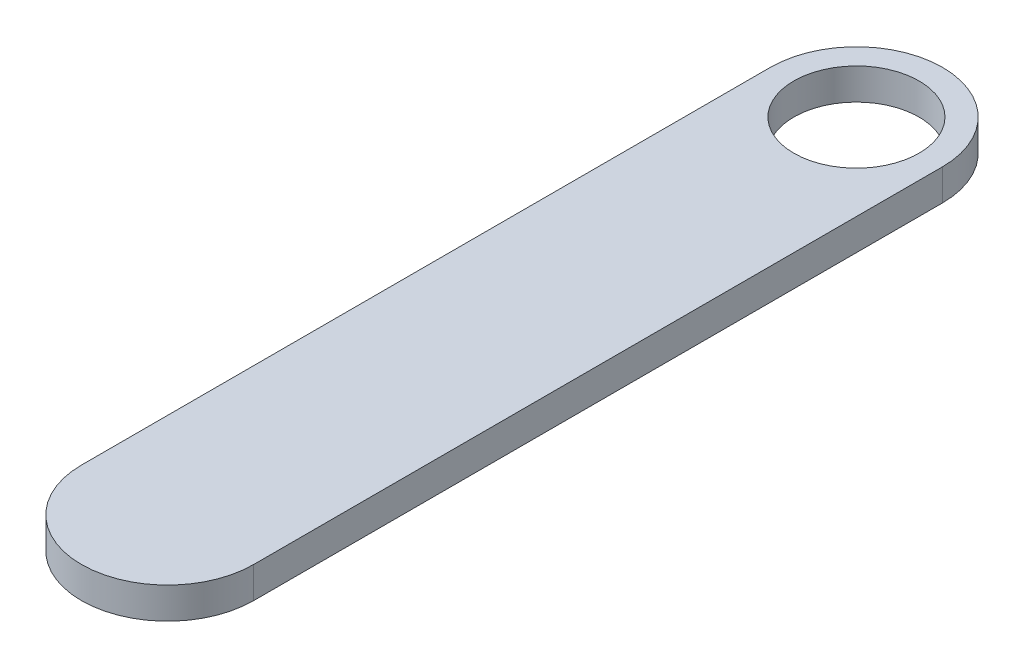
ISO-10303-21;
HEADER;
FILE_DESCRIPTION(('STEP AP214'),'2;1');
FILE_NAME('part.step','',(''),(''),'','','');
FILE_SCHEMA(('AUTOMOTIVE_DESIGN { 1 0 10303 214 1 1 1 1 }'));
ENDSEC;
DATA;
#1=APPLICATION_CONTEXT('core data for automotive mechanical design processes');
#2=APPLICATION_PROTOCOL_DEFINITION('international standard','automotive_design',2000,#1);
#3=PRODUCT_CONTEXT('',#1,'mechanical');
#4=PRODUCT('Part','Part','',(#3));
#5=PRODUCT_RELATED_PRODUCT_CATEGORY('part','',(#4));
#6=PRODUCT_DEFINITION_FORMATION('','',#4);
#7=PRODUCT_DEFINITION_CONTEXT('part definition',#1,'design');
#8=PRODUCT_DEFINITION('design','',#6,#7);
#9=PRODUCT_DEFINITION_SHAPE('','',#8);
#10=(LENGTH_UNIT() NAMED_UNIT(*) SI_UNIT(.MILLI.,.METRE.));
#11=(NAMED_UNIT(*) PLANE_ANGLE_UNIT() SI_UNIT($,.RADIAN.));
#12=(NAMED_UNIT(*) SI_UNIT($,.STERADIAN.) SOLID_ANGLE_UNIT());
#13=UNCERTAINTY_MEASURE_WITH_UNIT(LENGTH_MEASURE(1.E-05),#10,'distance_accuracy_value','');
#14=(GEOMETRIC_REPRESENTATION_CONTEXT(3) GLOBAL_UNCERTAINTY_ASSIGNED_CONTEXT((#13)) GLOBAL_UNIT_ASSIGNED_CONTEXT((#10,
#11,#12)) REPRESENTATION_CONTEXT('',''));
#15=CARTESIAN_POINT('',(0.,0.,0.));
#16=DIRECTION('',(0.,0.,1.));
#17=DIRECTION('',(1.,0.,0.));
#18=AXIS2_PLACEMENT_3D('',#15,#16,#17);
#19=CARTESIAN_POINT('',(0.,2.,0.));
#20=DIRECTION('',(0.,1.,0.));
#21=DIRECTION('',(0.,0.,1.));
#22=AXIS2_PLACEMENT_3D('',#19,#20,#21);
#23=PLANE('',#22);
#24=CARTESIAN_POINT('',(0.,2.,0.));
#25=DIRECTION('',(0.,1.,0.));
#26=DIRECTION('',(0.,0.,1.));
#27=AXIS2_PLACEMENT_3D('',#24,#25,#26);
#28=CIRCLE('',#27,5.5);
#29=CARTESIAN_POINT('',(-5.5,2.,0.));
#30=VERTEX_POINT('',#29);
#31=CARTESIAN_POINT('',(5.5,2.,0.));
#32=VERTEX_POINT('',#31);
#33=EDGE_CURVE('E94',#30,#32,#28,.T.);
#34=ORIENTED_EDGE('',*,*,#33,.T.);
#35=DIRECTION('',(0.,0.,-1.));
#36=VECTOR('',#35,1.);
#37=CARTESIAN_POINT('',(5.5,2.,0.));
#38=LINE('',#37,#36);
#39=CARTESIAN_POINT('',(5.5,2.,-44.));
#40=VERTEX_POINT('',#39);
#41=EDGE_CURVE('E89',#32,#40,#38,.T.);
#42=ORIENTED_EDGE('',*,*,#41,.T.);
#43=CARTESIAN_POINT('',(0.,2.,-44.));
#44=DIRECTION('',(0.,1.,0.));
#45=DIRECTION('',(0.,0.,1.));
#46=AXIS2_PLACEMENT_3D('',#43,#44,#45);
#47=CIRCLE('',#46,5.5);
#48=CARTESIAN_POINT('',(-5.5,2.,-44.));
#49=VERTEX_POINT('',#48);
#50=EDGE_CURVE('E92',#40,#49,#47,.T.);
#51=ORIENTED_EDGE('',*,*,#50,.T.);
#52=DIRECTION('',(0.,0.,1.));
#53=VECTOR('',#52,1.);
#54=CARTESIAN_POINT('',(-5.5,2.,0.));
#55=LINE('',#54,#53);
#56=EDGE_CURVE('E59',#49,#30,#55,.T.);
#57=ORIENTED_EDGE('',*,*,#56,.T.);
#58=EDGE_LOOP('',(#34,#42,#51,#57));
#59=FACE_BOUND('',#58,.T.);
#60=CARTESIAN_POINT('',(0.,2.,-44.));
#61=DIRECTION('',(0.,1.,0.));
#62=DIRECTION('',(0.,0.,1.));
#63=AXIS2_PLACEMENT_3D('',#60,#61,#62);
#64=CIRCLE('',#63,4.);
#65=CARTESIAN_POINT('',(0.,2.,-40.));
#66=VERTEX_POINT('',#65);
#67=EDGE_CURVE('E120',#66,#66,#64,.T.);
#68=ORIENTED_EDGE('',*,*,#67,.F.);
#69=EDGE_LOOP('',(#68));
#70=FACE_BOUND('',#69,.T.);
#71=ADVANCED_FACE('F42',(#59,#70),#23,.T.);
#72=CARTESIAN_POINT('',(0.,0.,0.));
#73=DIRECTION('',(0.,1.,0.));
#74=DIRECTION('',(0.,0.,1.));
#75=AXIS2_PLACEMENT_3D('',#72,#73,#74);
#76=PLANE('',#75);
#77=CARTESIAN_POINT('',(0.,0.,0.));
#78=DIRECTION('',(0.,1.,0.));
#79=DIRECTION('',(0.,0.,1.));
#80=AXIS2_PLACEMENT_3D('',#77,#78,#79);
#81=CIRCLE('',#80,5.5);
#82=CARTESIAN_POINT('',(-5.5,0.,0.));
#83=VERTEX_POINT('',#82);
#84=CARTESIAN_POINT('',(5.5,0.,0.));
#85=VERTEX_POINT('',#84);
#86=EDGE_CURVE('E124',#83,#85,#81,.T.);
#87=ORIENTED_EDGE('',*,*,#86,.F.);
#88=DIRECTION('',(0.,0.,1.));
#89=VECTOR('',#88,1.);
#90=CARTESIAN_POINT('',(-5.5,0.,0.));
#91=LINE('',#90,#89);
#92=CARTESIAN_POINT('',(-5.5,0.,-44.));
#93=VERTEX_POINT('',#92);
#94=EDGE_CURVE('E82',#93,#83,#91,.T.);
#95=ORIENTED_EDGE('',*,*,#94,.F.);
#96=CARTESIAN_POINT('',(0.,0.,-44.));
#97=DIRECTION('',(0.,1.,0.));
#98=DIRECTION('',(0.,0.,1.));
#99=AXIS2_PLACEMENT_3D('',#96,#97,#98);
#100=CIRCLE('',#99,5.5);
#101=CARTESIAN_POINT('',(5.5,0.,-44.));
#102=VERTEX_POINT('',#101);
#103=EDGE_CURVE('E76',#102,#93,#100,.T.);
#104=ORIENTED_EDGE('',*,*,#103,.F.);
#105=DIRECTION('',(0.,0.,-1.));
#106=VECTOR('',#105,1.);
#107=CARTESIAN_POINT('',(5.5,0.,0.));
#108=LINE('',#107,#106);
#109=EDGE_CURVE('E99',#85,#102,#108,.T.);
#110=ORIENTED_EDGE('',*,*,#109,.F.);
#111=EDGE_LOOP('',(#87,#95,#104,#110));
#112=FACE_BOUND('',#111,.T.);
#113=CARTESIAN_POINT('',(0.,0.,-44.));
#114=DIRECTION('',(0.,1.,0.));
#115=DIRECTION('',(0.,0.,1.));
#116=AXIS2_PLACEMENT_3D('',#113,#114,#115);
#117=CIRCLE('',#116,4.);
#118=CARTESIAN_POINT('',(0.,0.,-40.));
#119=VERTEX_POINT('',#118);
#120=EDGE_CURVE('E118',#119,#119,#117,.T.);
#121=ORIENTED_EDGE('',*,*,#120,.T.);
#122=EDGE_LOOP('',(#121));
#123=FACE_BOUND('',#122,.T.);
#124=ADVANCED_FACE('F137',(#112,#123),#76,.F.);
#125=CARTESIAN_POINT('',(0.,2.,0.));
#126=DIRECTION('',(0.,-1.,0.));
#127=DIRECTION('',(0.,0.,-1.));
#128=AXIS2_PLACEMENT_3D('',#125,#126,#127);
#129=CYLINDRICAL_SURFACE('',#128,5.5);
#130=ORIENTED_EDGE('',*,*,#86,.T.);
#131=DIRECTION('',(0.,-1.,0.));
#132=VECTOR('',#131,1.);
#133=CARTESIAN_POINT('',(5.5,2.,0.));
#134=LINE('',#133,#132);
#135=EDGE_CURVE('E12',#32,#85,#134,.T.);
#136=ORIENTED_EDGE('',*,*,#135,.F.);
#137=ORIENTED_EDGE('',*,*,#33,.F.);
#138=DIRECTION('',(0.,-1.,0.));
#139=VECTOR('',#138,1.);
#140=CARTESIAN_POINT('',(-5.5,2.,0.));
#141=LINE('',#140,#139);
#142=EDGE_CURVE('E105',#30,#83,#141,.T.);
#143=ORIENTED_EDGE('',*,*,#142,.T.);
#144=EDGE_LOOP('',(#130,#136,#137,#143));
#145=FACE_BOUND('',#144,.T.);
#146=ADVANCED_FACE('F44',(#145),#129,.T.);
#147=CARTESIAN_POINT('',(5.5,2.,0.));
#148=DIRECTION('',(-1.,0.,0.));
#149=DIRECTION('',(0.,0.,1.));
#150=AXIS2_PLACEMENT_3D('',#147,#148,#149);
#151=PLANE('',#150);
#152=ORIENTED_EDGE('',*,*,#109,.T.);
#153=DIRECTION('',(0.,-1.,0.));
#154=VECTOR('',#153,1.);
#155=CARTESIAN_POINT('',(5.5,2.,-44.));
#156=LINE('',#155,#154);
#157=EDGE_CURVE('E51',#40,#102,#156,.T.);
#158=ORIENTED_EDGE('',*,*,#157,.F.);
#159=ORIENTED_EDGE('',*,*,#41,.F.);
#160=ORIENTED_EDGE('',*,*,#135,.T.);
#161=EDGE_LOOP('',(#152,#158,#159,#160));
#162=FACE_BOUND('',#161,.T.);
#163=ADVANCED_FACE('F98',(#162),#151,.F.);
#164=CARTESIAN_POINT('',(0.,2.,-44.));
#165=DIRECTION('',(0.,-1.,0.));
#166=DIRECTION('',(0.,0.,-1.));
#167=AXIS2_PLACEMENT_3D('',#164,#165,#166);
#168=CYLINDRICAL_SURFACE('',#167,5.5);
#169=ORIENTED_EDGE('',*,*,#103,.T.);
#170=DIRECTION('',(0.,-1.,0.));
#171=VECTOR('',#170,1.);
#172=CARTESIAN_POINT('',(-5.5,2.,-44.));
#173=LINE('',#172,#171);
#174=EDGE_CURVE('E100',#49,#93,#173,.T.);
#175=ORIENTED_EDGE('',*,*,#174,.F.);
#176=ORIENTED_EDGE('',*,*,#50,.F.);
#177=ORIENTED_EDGE('',*,*,#157,.T.);
#178=EDGE_LOOP('',(#169,#175,#176,#177));
#179=FACE_BOUND('',#178,.T.);
#180=ADVANCED_FACE('F101',(#179),#168,.T.);
#181=CARTESIAN_POINT('',(-5.5,2.,0.));
#182=DIRECTION('',(1.,0.,0.));
#183=DIRECTION('',(0.,0.,-1.));
#184=AXIS2_PLACEMENT_3D('',#181,#182,#183);
#185=PLANE('',#184);
#186=ORIENTED_EDGE('',*,*,#94,.T.);
#187=ORIENTED_EDGE('',*,*,#142,.F.);
#188=ORIENTED_EDGE('',*,*,#56,.F.);
#189=ORIENTED_EDGE('',*,*,#174,.T.);
#190=EDGE_LOOP('',(#186,#187,#188,#189));
#191=FACE_BOUND('',#190,.T.);
#192=ADVANCED_FACE('F135',(#191),#185,.F.);
#193=CARTESIAN_POINT('',(0.,2.,-44.));
#194=DIRECTION('',(0.,-1.,0.));
#195=DIRECTION('',(0.,0.,-1.));
#196=AXIS2_PLACEMENT_3D('',#193,#194,#195);
#197=CYLINDRICAL_SURFACE('',#196,4.);
#198=ORIENTED_EDGE('',*,*,#67,.T.);
#199=EDGE_LOOP('',(#198));
#200=FACE_BOUND('',#199,.T.);
#201=ORIENTED_EDGE('',*,*,#120,.F.);
#202=EDGE_LOOP('',(#201));
#203=FACE_BOUND('',#202,.T.);
#204=ADVANCED_FACE('F150',(#200,#203),#197,.F.);
#205=CLOSED_SHELL('',(#71,#124,#146,#163,#180,#192,#204));
#206=MANIFOLD_SOLID_BREP('B2',#205);
#207=ADVANCED_BREP_SHAPE_REPRESENTATION('',(#18,#206),#14);
#208=SHAPE_DEFINITION_REPRESENTATION(#9,#207);
ENDSEC;
END-ISO-10303-21;
